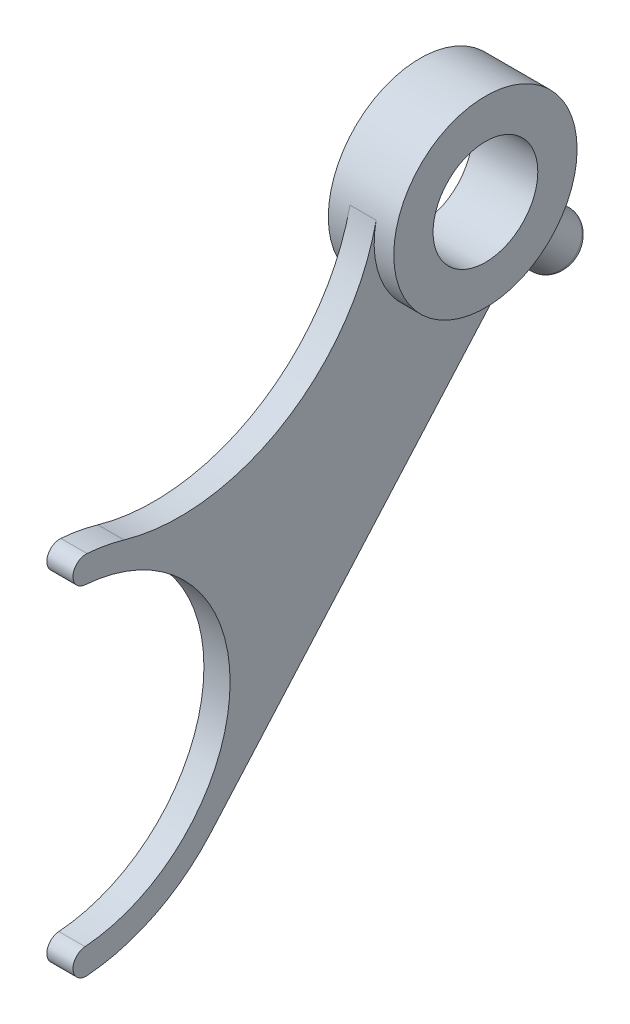
ISO-10303-21;
HEADER;
FILE_DESCRIPTION(('STEP AP214'),'2;1');
FILE_NAME('part.step','',(''),(''),'','','');
FILE_SCHEMA(('AUTOMOTIVE_DESIGN { 1 0 10303 214 1 1 1 1 }'));
ENDSEC;
DATA;
#1=APPLICATION_CONTEXT('core data for automotive mechanical design processes');
#2=APPLICATION_PROTOCOL_DEFINITION('international standard','automotive_design',2000,#1);
#3=PRODUCT_CONTEXT('',#1,'mechanical');
#4=PRODUCT('Part','Part','',(#3));
#5=PRODUCT_RELATED_PRODUCT_CATEGORY('part','',(#4));
#6=PRODUCT_DEFINITION_FORMATION('','',#4);
#7=PRODUCT_DEFINITION_CONTEXT('part definition',#1,'design');
#8=PRODUCT_DEFINITION('design','',#6,#7);
#9=PRODUCT_DEFINITION_SHAPE('','',#8);
#10=(LENGTH_UNIT() NAMED_UNIT(*) SI_UNIT(.MILLI.,.METRE.));
#11=(NAMED_UNIT(*) PLANE_ANGLE_UNIT() SI_UNIT($,.RADIAN.));
#12=(NAMED_UNIT(*) SI_UNIT($,.STERADIAN.) SOLID_ANGLE_UNIT());
#13=UNCERTAINTY_MEASURE_WITH_UNIT(LENGTH_MEASURE(1.E-05),#10,'distance_accuracy_value','');
#14=(GEOMETRIC_REPRESENTATION_CONTEXT(3) GLOBAL_UNCERTAINTY_ASSIGNED_CONTEXT((#13)) GLOBAL_UNIT_ASSIGNED_CONTEXT((#10,
#11,#12)) REPRESENTATION_CONTEXT('',''));
#15=CARTESIAN_POINT('',(0.,0.,0.));
#16=DIRECTION('',(0.,0.,1.));
#17=DIRECTION('',(1.,0.,0.));
#18=AXIS2_PLACEMENT_3D('',#15,#16,#17);
#19=CARTESIAN_POINT('',(1.2,-11.5355556337102,29.0769230769016));
#20=CARTESIAN_POINT('',(1.13333333333346,-11.5355556337102,29.0769230769016));
#21=CARTESIAN_POINT('',(1.0666666666665,-11.5355556337135,29.0769230768585));
#22=CARTESIAN_POINT('',(0.333333333335052,-11.5355556337134,29.0769230768611));
#23=CARTESIAN_POINT('',(-0.333333333333171,-11.5355556337135,29.0769230768587));
#24=CARTESIAN_POINT('',(-1.06666666666668,-11.5355556337135,29.0769230768587));
#25=CARTESIAN_POINT('',(-1.13333333333332,-11.5355556337102,29.0769230769016));
#26=CARTESIAN_POINT('',(-1.2,-11.5355556337102,29.0769230769016));
#27=CARTESIAN_POINT('',(1.2,-11.4842735824361,29.7416144305945));
#28=CARTESIAN_POINT('',(1.13333333333338,-11.4842735824361,29.7416144305945));
#29=CARTESIAN_POINT('',(1.06666666666663,-11.4842735824555,29.7416144305715));
#30=CARTESIAN_POINT('',(0.333333333335951,-11.484273582453,29.7416144305728));
#31=CARTESIAN_POINT('',(-0.333333333333171,-11.4842735824553,29.7416144305716));
#32=CARTESIAN_POINT('',(-1.06666666666668,-11.4842735824553,29.7416144305716));
#33=CARTESIAN_POINT('',(-1.13333333333332,-11.4842735824361,29.7416144305945));
#34=CARTESIAN_POINT('',(-1.2,-11.4842735824361,29.7416144305945));
#35=CARTESIAN_POINT('',(1.2,-10.9216525030672,30.5340170842672));
#36=CARTESIAN_POINT('',(1.13333333333327,-10.9216525030672,30.5340170842672));
#37=CARTESIAN_POINT('',(1.06666666666679,-10.9216525030781,30.534017084306));
#38=CARTESIAN_POINT('',(0.333333333337147,-10.9216525030762,30.5340170843022));
#39=CARTESIAN_POINT('',(-0.333333333333171,-10.921652503078,30.5340170843056));
#40=CARTESIAN_POINT('',(-1.06666666666668,-10.921652503078,30.5340170843056));
#41=CARTESIAN_POINT('',(-1.13333333333332,-10.9216525030672,30.5340170842672));
#42=CARTESIAN_POINT('',(-1.2,-10.9216525030672,30.5340170842672));
#43=CARTESIAN_POINT('',(1.2,-9.92461547251794,30.4570940073383));
#44=CARTESIAN_POINT('',(1.13333333333328,-9.92461547251794,30.4570940073383));
#45=CARTESIAN_POINT('',(1.06666666666678,-9.92461547247854,30.4570940073654));
#46=CARTESIAN_POINT('',(0.333333333337292,-9.92461547248108,30.4570940073616));
#47=CARTESIAN_POINT('',(-0.333333333333171,-9.92461547247877,30.4570940073651));
#48=CARTESIAN_POINT('',(-1.06666666666668,-9.92461547247877,30.4570940073651));
#49=CARTESIAN_POINT('',(-1.13333333333332,-9.92461547251794,30.4570940073383));
#50=CARTESIAN_POINT('',(-1.2,-9.92461547251794,30.4570940073383));
#51=CARTESIAN_POINT('',(1.2,-9.49019952136567,29.5877682767389));
#52=CARTESIAN_POINT('',(1.1333333333334,-9.49019952136567,29.5877682767389));
#53=CARTESIAN_POINT('',(1.0666666666666,-9.49019952134094,29.5877682766969));
#54=CARTESIAN_POINT('',(0.33333333333624,-9.49019952134284,29.5877682766982));
#55=CARTESIAN_POINT('',(-0.333333333333171,-9.49019952134111,29.587768276697));
#56=CARTESIAN_POINT('',(-1.06666666666668,-9.49019952134111,29.587768276697));
#57=CARTESIAN_POINT('',(-1.13333333333332,-9.49019952136567,29.5877682767389));
#58=CARTESIAN_POINT('',(-1.2,-9.49019952136567,29.5877682767389));
#59=CARTESIAN_POINT('',(1.2,-9.54148157266225,28.9230769230477));
#60=CARTESIAN_POINT('',(1.13333333333348,-9.54148157266225,28.9230769230477));
#61=CARTESIAN_POINT('',(1.06666666666647,-9.54148157266677,28.9230769229891));
#62=CARTESIAN_POINT('',(0.333333333335341,-9.54148157266658,28.9230769229917));
#63=CARTESIAN_POINT('',(-0.333333333333171,-9.54148157266676,28.9230769229894));
#64=CARTESIAN_POINT('',(-1.06666666666668,-9.54148157266676,28.9230769229894));
#65=CARTESIAN_POINT('',(-1.13333333333332,-9.54148157266225,28.9230769230477));
#66=CARTESIAN_POINT('',(-1.2,-9.54148157266225,28.9230769230477));
#67=(BOUNDED_SURFACE() B_SPLINE_SURFACE(5,3,((#19,#20,#21,#22,#23,#24,#25,#26),(#27,#28,#29,#30,
#31,#32,#33,#34),(#35,#36,#37,#38,#39,#40,#41,#42),(#43,#44,#45,#46,#47,#48,#49,#50),(#51,#52,
#53,#54,#55,#56,#57,#58),(#59,#60,#61,#62,#63,#64,#65,#66)),.UNSPECIFIED.,.F.,.F.,
.F.) B_SPLINE_SURFACE_WITH_KNOTS((6,6),(4,2,2,4),(0.,1.),(-0.1,0.,1.,1.1),
.UNSPECIFIED.) GEOMETRIC_REPRESENTATION_ITEM() RATIONAL_B_SPLINE_SURFACE(((1.,1.,1.,1.,1.,1.,1.,
1.),(0.599999999993241,0.599999999993241,0.599999999979541,0.599999999981577,0.599999999979726,
0.599999999979726,0.599999999993241,0.599999999993241),(0.399999999989862,0.399999999989862,
0.399999999969312,0.399999999972365,0.399999999969589,0.399999999969589,0.399999999989862,
0.399999999989862),(0.399999999989862,0.399999999989862,0.399999999969312,0.399999999972365,
0.399999999969589,0.399999999969589,0.399999999989862,0.399999999989862),(0.599999999993241,
0.599999999993241,0.599999999979541,0.599999999981577,0.599999999979726,0.599999999979726,
0.599999999993241,0.599999999993241),(1.,1.,1.,1.,1.,1.,1.,1.))) REPRESENTATION_ITEM('') SURFACE());
#68=CARTESIAN_POINT('',(1.2,-9.54148157266225,28.9230769230477));
#69=CARTESIAN_POINT('',(1.13333333333348,-9.54148157266225,28.9230769230477));
#70=CARTESIAN_POINT('',(1.06666666666647,-9.54148157266677,28.9230769229891));
#71=CARTESIAN_POINT('',(0.333333333335341,-9.54148157266658,28.9230769229917));
#72=CARTESIAN_POINT('',(-0.333333333333171,-9.54148157266676,28.9230769229894));
#73=CARTESIAN_POINT('',(-1.06666666666668,-9.54148157266676,28.9230769229894));
#74=CARTESIAN_POINT('',(-1.13333333333332,-9.54148157266225,28.9230769230477));
#75=CARTESIAN_POINT('',(-1.2,-9.54148157266225,28.9230769230477));
#76=(BOUNDED_CURVE() B_SPLINE_CURVE(3,(#68,#69,#70,#71,#72,#73,#74,#75),.UNSPECIFIED.,.F.,
.F.) B_SPLINE_CURVE_WITH_KNOTS((4,2,2,4),(-0.1,0.,1.,1.1),
.UNSPECIFIED.) CURVE() GEOMETRIC_REPRESENTATION_ITEM() RATIONAL_B_SPLINE_CURVE((1.,1.,1.,1.,1.,
1.,1.,1.)) REPRESENTATION_ITEM(''));
#77=CARTESIAN_POINT('',(-1.,-9.54148157266676,28.9230769229894));
#78=VERTEX_POINT('',#77);
#79=CARTESIAN_POINT('',(1.,-9.54148157266676,28.9230769229894));
#80=VERTEX_POINT('',#79);
#81=EDGE_CURVE('E210',#78,#80,#76,.F.);
#82=CARTESIAN_POINT('',(-1.,-9.54148157266676,28.9230769229894));
#83=CARTESIAN_POINT('',(-1.,-9.49019952134111,29.587768276697));
#84=CARTESIAN_POINT('',(-1.,-9.92461547247877,30.4570940073651));
#85=CARTESIAN_POINT('',(-1.,-10.921652503078,30.5340170843056));
#86=CARTESIAN_POINT('',(-1.,-11.4842735824553,29.7416144305716));
#87=CARTESIAN_POINT('',(-1.,-11.5355556337135,29.0769230768587));
#88=(BOUNDED_CURVE() B_SPLINE_CURVE(5,(#82,#83,#84,#85,#86,#87),.UNSPECIFIED.,.F.,
.F.) B_SPLINE_CURVE_WITH_KNOTS((6,6),(0.,1.),
.UNSPECIFIED.) CURVE() GEOMETRIC_REPRESENTATION_ITEM() RATIONAL_B_SPLINE_CURVE((1.,
0.599999999979726,0.399999999969589,0.399999999969589,0.599999999979726,1.)) REPRESENTATION_ITEM(''));
#89=CARTESIAN_POINT('',(-1.,-11.5355556337135,29.0769230768587));
#90=VERTEX_POINT('',#89);
#91=EDGE_CURVE('E61',#90,#78,#88,.F.);
#92=CARTESIAN_POINT('',(-1.2,-11.5355556337102,29.0769230769016));
#93=CARTESIAN_POINT('',(-1.13333333333332,-11.5355556337102,29.0769230769016));
#94=CARTESIAN_POINT('',(-1.06666666666668,-11.5355556337135,29.0769230768587));
#95=CARTESIAN_POINT('',(-0.333333333333171,-11.5355556337135,29.0769230768587));
#96=CARTESIAN_POINT('',(0.333333333335052,-11.5355556337134,29.0769230768611));
#97=CARTESIAN_POINT('',(1.0666666666665,-11.5355556337135,29.0769230768585));
#98=CARTESIAN_POINT('',(1.13333333333346,-11.5355556337102,29.0769230769016));
#99=CARTESIAN_POINT('',(1.2,-11.5355556337102,29.0769230769016));
#100=(BOUNDED_CURVE() B_SPLINE_CURVE(3,(#92,#93,#94,#95,#96,#97,#98,#99),.UNSPECIFIED.,.F.,
.F.) B_SPLINE_CURVE_WITH_KNOTS((4,2,2,4),(-0.1,0.,1.,1.1),
.UNSPECIFIED.) CURVE() GEOMETRIC_REPRESENTATION_ITEM() RATIONAL_B_SPLINE_CURVE((1.,1.,1.,1.,1.,
1.,1.,1.)) REPRESENTATION_ITEM(''));
#101=CARTESIAN_POINT('',(1.,-11.5355556337135,29.0769230768587));
#102=VERTEX_POINT('',#101);
#103=EDGE_CURVE('E213',#102,#90,#100,.F.);
#104=CARTESIAN_POINT('',(0.999999999999999,-11.5355556337135,29.0769230768587));
#105=CARTESIAN_POINT('',(0.999999999999999,-11.4842735824553,29.7416144305716));
#106=CARTESIAN_POINT('',(0.999999999999999,-10.921652503078,30.5340170843056));
#107=CARTESIAN_POINT('',(0.999999999999999,-9.92461547247877,30.4570940073651));
#108=CARTESIAN_POINT('',(1.,-9.49019952134111,29.587768276697));
#109=CARTESIAN_POINT('',(0.999999999999999,-9.54148157266676,28.9230769229894));
#110=(BOUNDED_CURVE() B_SPLINE_CURVE(5,(#104,#105,#106,#107,#108,#109),.UNSPECIFIED.,.F.,
.F.) B_SPLINE_CURVE_WITH_KNOTS((6,6),(0.,1.),
.UNSPECIFIED.) CURVE() GEOMETRIC_REPRESENTATION_ITEM() RATIONAL_B_SPLINE_CURVE((1.,
0.599999999979726,0.399999999969589,0.399999999969589,0.599999999979726,1.)) REPRESENTATION_ITEM(''));
#111=EDGE_CURVE('E11',#80,#102,#110,.F.);
#112=ORIENTED_EDGE('',*,*,#81,.F.);
#113=ORIENTED_EDGE('',*,*,#91,.F.);
#114=ORIENTED_EDGE('',*,*,#103,.F.);
#115=ORIENTED_EDGE('',*,*,#111,.F.);
#116=EDGE_LOOP('',(#112,#113,#114,#115));
#117=FACE_BOUND('',#116,.T.);
#118=ADVANCED_FACE('F50',(#117),#67,.T.);
#119=CARTESIAN_POINT('',(1.2,-37.45851842734,28.9230769230769));
#120=CARTESIAN_POINT('',(1.13333333333348,-37.45851842734,28.9230769230769));
#121=CARTESIAN_POINT('',(1.06666666666647,-37.45851842734,28.9230769230774));
#122=CARTESIAN_POINT('',(0.333333333335341,-37.4585184273397,28.9230769230723));
#123=CARTESIAN_POINT('',(-0.333333333333171,-37.45851842734,28.9230769230769));
#124=CARTESIAN_POINT('',(-1.06666666666668,-37.45851842734,28.9230769230769));
#125=CARTESIAN_POINT('',(-1.13333333333332,-37.45851842734,28.9230769230769));
#126=CARTESIAN_POINT('',(-1.2,-37.45851842734,28.9230769230769));
#127=CARTESIAN_POINT('',(1.2,-37.5098004786221,29.5877682767598));
#128=CARTESIAN_POINT('',(1.1333333333334,-37.5098004786221,29.5877682767598));
#129=CARTESIAN_POINT('',(1.06666666666658,-37.5098004786218,29.5877682767601));
#130=CARTESIAN_POINT('',(0.333333333334184,-37.5098004786244,29.5877682767563));
#131=CARTESIAN_POINT('',(-0.333333333333171,-37.5098004786221,29.5877682767598));
#132=CARTESIAN_POINT('',(-1.06666666666668,-37.5098004786221,29.5877682767598));
#133=CARTESIAN_POINT('',(-1.13333333333332,-37.5098004786221,29.5877682767598));
#134=CARTESIAN_POINT('',(-1.2,-37.5098004786221,29.5877682767598));
#135=CARTESIAN_POINT('',(1.2,-37.0753845274625,30.4570940073249));
#136=CARTESIAN_POINT('',(1.13333333333328,-37.0753845274625,30.4570940073249));
#137=CARTESIAN_POINT('',(1.06666666666673,-37.0753845274622,30.4570940073248));
#138=CARTESIAN_POINT('',(0.333333333332666,-37.0753845274648,30.457094007326));
#139=CARTESIAN_POINT('',(-0.333333333333171,-37.0753845274625,30.4570940073249));
#140=CARTESIAN_POINT('',(-1.06666666666668,-37.0753845274625,30.4570940073249));
#141=CARTESIAN_POINT('',(-1.13333333333332,-37.0753845274625,30.4570940073249));
#142=CARTESIAN_POINT('',(-1.2,-37.0753845274625,30.4570940073249));
#143=CARTESIAN_POINT('',(1.2,-36.0783474969382,30.534017084248));
#144=CARTESIAN_POINT('',(1.13333333333327,-36.0783474969382,30.534017084248));
#145=CARTESIAN_POINT('',(1.06666666666675,-36.0783474969384,30.534017084248));
#146=CARTESIAN_POINT('',(0.333333333332522,-36.0783474969359,30.534017084248));
#147=CARTESIAN_POINT('',(-0.333333333333171,-36.0783474969382,30.534017084248));
#148=CARTESIAN_POINT('',(-1.06666666666668,-36.0783474969382,30.534017084248));
#149=CARTESIAN_POINT('',(-1.13333333333332,-36.0783474969382,30.534017084248));
#150=CARTESIAN_POINT('',(-1.2,-36.0783474969382,30.534017084248));
#151=CARTESIAN_POINT('',(1.2,-35.5157264175735,29.7416144306059));
#152=CARTESIAN_POINT('',(1.13333333333338,-35.5157264175735,29.7416144306059));
#153=CARTESIAN_POINT('',(1.06666666666661,-35.5157264175737,29.741614430606));
#154=CARTESIAN_POINT('',(0.333333333333895,-35.5157264175712,29.7416144306048));
#155=CARTESIAN_POINT('',(-0.333333333333171,-35.5157264175735,29.7416144306059));
#156=CARTESIAN_POINT('',(-1.06666666666668,-35.5157264175735,29.7416144306059));
#157=CARTESIAN_POINT('',(-1.13333333333332,-35.5157264175735,29.7416144306059));
#158=CARTESIAN_POINT('',(-1.2,-35.5157264175735,29.7416144306059));
#159=CARTESIAN_POINT('',(1.2,-35.4644443662914,29.0769230769231));
#160=CARTESIAN_POINT('',(1.13333333333346,-35.4644443662914,29.0769230769231));
#161=CARTESIAN_POINT('',(1.0666666666665,-35.4644443662915,29.0769230769234));
#162=CARTESIAN_POINT('',(0.333333333335052,-35.4644443662912,29.0769230769196));
#163=CARTESIAN_POINT('',(-0.333333333333171,-35.4644443662914,29.0769230769231));
#164=CARTESIAN_POINT('',(-1.06666666666668,-35.4644443662914,29.0769230769231));
#165=CARTESIAN_POINT('',(-1.13333333333332,-35.4644443662914,29.0769230769231));
#166=CARTESIAN_POINT('',(-1.2,-35.4644443662914,29.0769230769231));
#167=(BOUNDED_SURFACE() B_SPLINE_SURFACE(5,3,((#119,#120,#121,#122,#123,#124,#125,#126),(#127,
#128,#129,#130,#131,#132,#133,#134),(#135,#136,#137,#138,#139,#140,#141,#142),(#143,#144,#145,
#146,#147,#148,#149,#150),(#151,#152,#153,#154,#155,#156,#157,#158),(#159,#160,#161,#162,#163,
#164,#165,#166)),.UNSPECIFIED.,.F.,.F.,.F.) B_SPLINE_SURFACE_WITH_KNOTS((6,6),(4,2,2,4),(0.,1.),
(-0.1,0.,1.,1.1),.UNSPECIFIED.) GEOMETRIC_REPRESENTATION_ITEM() RATIONAL_B_SPLINE_SURFACE(((1.,
1.,1.,1.,1.,1.,1.,1.),(0.600000000000001,0.600000000000001,0.600000000000001,0.600000000000001,
0.600000000000001,0.600000000000001,0.600000000000001,0.600000000000001),(0.400000000000002,
0.400000000000002,0.400000000000002,0.400000000000002,0.400000000000002,0.400000000000002,
0.400000000000002,0.400000000000002),(0.400000000000002,0.400000000000002,0.400000000000002,
0.400000000000002,0.400000000000002,0.400000000000002,0.400000000000002,0.400000000000002),
(0.600000000000001,0.600000000000001,0.600000000000001,0.600000000000001,0.600000000000001,
0.600000000000001,0.600000000000001,0.600000000000001),(1.,1.,1.,1.,1.,1.,1.,1.))) REPRESENTATION_ITEM('') SURFACE());
#168=CARTESIAN_POINT('',(-1.2,-37.45851842734,28.9230769230769));
#169=CARTESIAN_POINT('',(-1.13333333333332,-37.45851842734,28.9230769230769));
#170=CARTESIAN_POINT('',(-1.06666666666668,-37.45851842734,28.9230769230769));
#171=CARTESIAN_POINT('',(-0.333333333333171,-37.45851842734,28.9230769230769));
#172=CARTESIAN_POINT('',(0.333333333335341,-37.4585184273397,28.9230769230723));
#173=CARTESIAN_POINT('',(1.06666666666647,-37.45851842734,28.9230769230774));
#174=CARTESIAN_POINT('',(1.13333333333348,-37.45851842734,28.9230769230769));
#175=CARTESIAN_POINT('',(1.2,-37.45851842734,28.9230769230769));
#176=(BOUNDED_CURVE() B_SPLINE_CURVE(3,(#168,#169,#170,#171,#172,#173,#174,#175),.UNSPECIFIED.,
.F.,.F.) B_SPLINE_CURVE_WITH_KNOTS((4,2,2,4),(-0.1,0.,1.,1.1),
.UNSPECIFIED.) CURVE() GEOMETRIC_REPRESENTATION_ITEM() RATIONAL_B_SPLINE_CURVE((1.,1.,1.,1.,1.,
1.,1.,1.)) REPRESENTATION_ITEM(''));
#177=CARTESIAN_POINT('',(1.,-37.45851842734,28.9230769230769));
#178=VERTEX_POINT('',#177);
#179=CARTESIAN_POINT('',(-1.,-37.45851842734,28.9230769230769));
#180=VERTEX_POINT('',#179);
#181=EDGE_CURVE('E379',#178,#180,#176,.F.);
#182=CARTESIAN_POINT('',(1.,-37.45851842734,28.9230769230769));
#183=CARTESIAN_POINT('',(1.,-37.5098004786221,29.5877682767598));
#184=CARTESIAN_POINT('',(1.,-37.0753845274625,30.4570940073249));
#185=CARTESIAN_POINT('',(1.,-36.0783474969382,30.534017084248));
#186=CARTESIAN_POINT('',(1.,-35.5157264175735,29.7416144306059));
#187=CARTESIAN_POINT('',(1.,-35.4644443662914,29.0769230769231));
#188=(BOUNDED_CURVE() B_SPLINE_CURVE(5,(#182,#183,#184,#185,#186,#187),.UNSPECIFIED.,.F.,
.F.) B_SPLINE_CURVE_WITH_KNOTS((6,6),(0.,1.),
.UNSPECIFIED.) CURVE() GEOMETRIC_REPRESENTATION_ITEM() RATIONAL_B_SPLINE_CURVE((1.,
0.600000000000001,0.400000000000002,0.400000000000002,0.600000000000001,1.)) REPRESENTATION_ITEM(''));
#189=CARTESIAN_POINT('',(1.,-35.4644443662914,29.0769230769231));
#190=VERTEX_POINT('',#189);
#191=EDGE_CURVE('E418',#190,#178,#188,.F.);
#192=CARTESIAN_POINT('',(1.2,-35.4644443662914,29.0769230769231));
#193=CARTESIAN_POINT('',(1.13333333333346,-35.4644443662914,29.0769230769231));
#194=CARTESIAN_POINT('',(1.0666666666665,-35.4644443662915,29.0769230769234));
#195=CARTESIAN_POINT('',(0.333333333335052,-35.4644443662912,29.0769230769196));
#196=CARTESIAN_POINT('',(-0.333333333333171,-35.4644443662914,29.0769230769231));
#197=CARTESIAN_POINT('',(-1.06666666666668,-35.4644443662914,29.0769230769231));
#198=CARTESIAN_POINT('',(-1.13333333333332,-35.4644443662914,29.0769230769231));
#199=CARTESIAN_POINT('',(-1.2,-35.4644443662914,29.0769230769231));
#200=(BOUNDED_CURVE() B_SPLINE_CURVE(3,(#192,#193,#194,#195,#196,#197,#198,#199),.UNSPECIFIED.,
.F.,.F.) B_SPLINE_CURVE_WITH_KNOTS((4,2,2,4),(-0.1,0.,1.,1.1),
.UNSPECIFIED.) CURVE() GEOMETRIC_REPRESENTATION_ITEM() RATIONAL_B_SPLINE_CURVE((1.,1.,1.,1.,1.,
1.,1.,1.)) REPRESENTATION_ITEM(''));
#201=CARTESIAN_POINT('',(-1.,-35.4644443662914,29.0769230769231));
#202=VERTEX_POINT('',#201);
#203=EDGE_CURVE('E323',#202,#190,#200,.F.);
#204=CARTESIAN_POINT('',(-1.,-35.4644443662914,29.0769230769231));
#205=CARTESIAN_POINT('',(-1.,-35.5157264175735,29.7416144306059));
#206=CARTESIAN_POINT('',(-1.,-36.0783474969382,30.534017084248));
#207=CARTESIAN_POINT('',(-1.,-37.0753845274625,30.4570940073249));
#208=CARTESIAN_POINT('',(-1.,-37.5098004786221,29.5877682767598));
#209=CARTESIAN_POINT('',(-1.,-37.45851842734,28.9230769230769));
#210=(BOUNDED_CURVE() B_SPLINE_CURVE(5,(#204,#205,#206,#207,#208,#209),.UNSPECIFIED.,.F.,
.F.) B_SPLINE_CURVE_WITH_KNOTS((6,6),(0.,1.),
.UNSPECIFIED.) CURVE() GEOMETRIC_REPRESENTATION_ITEM() RATIONAL_B_SPLINE_CURVE((1.,
0.600000000000001,0.400000000000002,0.400000000000002,0.600000000000001,1.)) REPRESENTATION_ITEM(''));
#211=EDGE_CURVE('E212',#180,#202,#210,.F.);
#212=ORIENTED_EDGE('',*,*,#181,.F.);
#213=ORIENTED_EDGE('',*,*,#191,.F.);
#214=ORIENTED_EDGE('',*,*,#203,.F.);
#215=ORIENTED_EDGE('',*,*,#211,.F.);
#216=EDGE_LOOP('',(#212,#213,#214,#215));
#217=FACE_BOUND('',#216,.T.);
#218=ADVANCED_FACE('F199',(#217),#167,.T.);
#219=CARTESIAN_POINT('',(1.,0.,0.));
#220=DIRECTION('',(1.,0.,0.));
#221=DIRECTION('',(0.,0.,-1.));
#222=AXIS2_PLACEMENT_3D('',#219,#220,#221);
#223=PLANE('',#222);
#224=CARTESIAN_POINT('',(1.,-23.5,30.));
#225=DIRECTION('',(1.,0.,0.));
#226=DIRECTION('',(0.,0.,-1.));
#227=AXIS2_PLACEMENT_3D('',#224,#225,#226);
#228=CIRCLE('',#227,14.);
#229=CARTESIAN_POINT('',(1.,-10.0532803966568,26.1031125357454));
#230=VERTEX_POINT('',#229);
#231=EDGE_CURVE('E241',#230,#80,#228,.T.);
#232=ORIENTED_EDGE('',*,*,#231,.T.);
#233=ORIENTED_EDGE('',*,*,#111,.T.);
#234=CARTESIAN_POINT('',(1.,-23.5,30.));
#235=DIRECTION('',(1.,0.,0.));
#236=DIRECTION('',(0.,0.,-1.));
#237=AXIS2_PLACEMENT_3D('',#234,#235,#236);
#238=CIRCLE('',#237,12.);
#239=EDGE_CURVE('E221',#190,#102,#238,.T.);
#240=ORIENTED_EDGE('',*,*,#239,.F.);
#241=ORIENTED_EDGE('',*,*,#191,.T.);
#242=CARTESIAN_POINT('',(1.,-32.747850597645,19.4891836985114));
#243=VERTEX_POINT('',#242);
#244=EDGE_CURVE('E232',#178,#243,#228,.T.);
#245=ORIENTED_EDGE('',*,*,#244,.T.);
#246=DIRECTION('',(0.,0.750772592963468,-0.660560756974641));
#247=VECTOR('',#246,1.);
#248=CARTESIAN_POINT('',(1.,-4.62392529882248,-5.25540815074428));
#249=LINE('',#248,#247);
#250=CARTESIAN_POINT('',(1.,-6.26287883441165,-3.81338909162857));
#251=VERTEX_POINT('',#250);
#252=EDGE_CURVE('E135',#243,#251,#249,.T.);
#253=ORIENTED_EDGE('',*,*,#252,.T.);
#254=DIRECTION('',(0.,0.707106781186541,0.707106781186554));
#255=VECTOR('',#254,1.);
#256=CARTESIAN_POINT('',(1.,-1.2247448713916,1.22474487139158));
#257=LINE('',#256,#255);
#258=CARTESIAN_POINT('',(1.,-6.02057639470428,-3.57108665192118));
#259=VERTEX_POINT('',#258);
#260=EDGE_CURVE('E137',#251,#259,#257,.T.);
#261=ORIENTED_EDGE('',*,*,#260,.T.);
#262=CARTESIAN_POINT('',(1.,0.,0.));
#263=DIRECTION('',(1.,0.,0.));
#264=DIRECTION('',(0.,0.,-1.));
#265=AXIS2_PLACEMENT_3D('',#262,#263,#264);
#266=CIRCLE('',#265,7.);
#267=CARTESIAN_POINT('',(1.,1.46422494326146,6.84514757441583));
#268=VERTEX_POINT('',#267);
#269=EDGE_CURVE('E124',#268,#259,#266,.T.);
#270=ORIENTED_EDGE('',*,*,#269,.F.);
#271=CARTESIAN_POINT('',(1.,4.67087756900406,21.8360207623865));
#272=DIRECTION('',(1.,0.,0.));
#273=DIRECTION('',(0.,0.,-1.));
#274=AXIS2_PLACEMENT_3D('',#271,#272,#273);
#275=CIRCLE('',#274,15.33);
#276=EDGE_CURVE('E133',#230,#268,#275,.T.);
#277=ORIENTED_EDGE('',*,*,#276,.F.);
#278=EDGE_LOOP('',(#232,#233,#240,#241,#245,#253,#261,#270,#277));
#279=FACE_BOUND('',#278,.T.);
#280=ADVANCED_FACE('F139',(#279),#223,.T.);
#281=CARTESIAN_POINT('',(-1.,0.,0.));
#282=DIRECTION('',(1.,0.,0.));
#283=DIRECTION('',(0.,0.,-1.));
#284=AXIS2_PLACEMENT_3D('',#281,#282,#283);
#285=PLANE('',#284);
#286=CARTESIAN_POINT('',(-1.,-23.5,30.));
#287=DIRECTION('',(1.,0.,0.));
#288=DIRECTION('',(0.,0.,-1.));
#289=AXIS2_PLACEMENT_3D('',#286,#287,#288);
#290=CIRCLE('',#289,12.);
#291=EDGE_CURVE('E254',#202,#90,#290,.T.);
#292=ORIENTED_EDGE('',*,*,#291,.T.);
#293=ORIENTED_EDGE('',*,*,#91,.T.);
#294=CARTESIAN_POINT('',(-1.,-23.5,30.));
#295=DIRECTION('',(1.,0.,0.));
#296=DIRECTION('',(0.,0.,-1.));
#297=AXIS2_PLACEMENT_3D('',#294,#295,#296);
#298=CIRCLE('',#297,14.);
#299=CARTESIAN_POINT('',(-1.,-10.0532803966568,26.1031125357454));
#300=VERTEX_POINT('',#299);
#301=EDGE_CURVE('E217',#300,#78,#298,.T.);
#302=ORIENTED_EDGE('',*,*,#301,.F.);
#303=CARTESIAN_POINT('',(-1.,4.67087756900406,21.8360207623865));
#304=DIRECTION('',(1.,0.,0.));
#305=DIRECTION('',(0.,0.,-1.));
#306=AXIS2_PLACEMENT_3D('',#303,#304,#305);
#307=CIRCLE('',#306,15.33);
#308=CARTESIAN_POINT('',(-1.,1.46422494326146,6.84514757441583));
#309=VERTEX_POINT('',#308);
#310=EDGE_CURVE('E223',#300,#309,#307,.T.);
#311=ORIENTED_EDGE('',*,*,#310,.T.);
#312=CARTESIAN_POINT('',(-1.,0.,0.));
#313=DIRECTION('',(1.,0.,0.));
#314=DIRECTION('',(0.,0.,-1.));
#315=AXIS2_PLACEMENT_3D('',#312,#313,#314);
#316=CIRCLE('',#315,7.);
#317=CARTESIAN_POINT('',(-1.,-6.02057639470428,-3.57108665192118));
#318=VERTEX_POINT('',#317);
#319=EDGE_CURVE('E234',#309,#318,#316,.T.);
#320=ORIENTED_EDGE('',*,*,#319,.T.);
#321=DIRECTION('',(0.,0.707106781186541,0.707106781186554));
#322=VECTOR('',#321,1.);
#323=CARTESIAN_POINT('',(-1.,-1.2247448713916,1.22474487139158));
#324=LINE('',#323,#322);
#325=CARTESIAN_POINT('',(-1.,-6.26287883441165,-3.81338909162857));
#326=VERTEX_POINT('',#325);
#327=EDGE_CURVE('E148',#326,#318,#324,.T.);
#328=ORIENTED_EDGE('',*,*,#327,.F.);
#329=DIRECTION('',(0.,0.750772592963468,-0.660560756974641));
#330=VECTOR('',#329,1.);
#331=CARTESIAN_POINT('',(-1.,-4.62392529882248,-5.25540815074428));
#332=LINE('',#331,#330);
#333=CARTESIAN_POINT('',(-1.,-32.747850597645,19.4891836985114));
#334=VERTEX_POINT('',#333);
#335=EDGE_CURVE('E248',#334,#326,#332,.T.);
#336=ORIENTED_EDGE('',*,*,#335,.F.);
#337=EDGE_CURVE('E252',#180,#334,#298,.T.);
#338=ORIENTED_EDGE('',*,*,#337,.F.);
#339=ORIENTED_EDGE('',*,*,#211,.T.);
#340=EDGE_LOOP('',(#292,#293,#302,#311,#320,#328,#336,#338,#339));
#341=FACE_BOUND('',#340,.T.);
#342=ADVANCED_FACE('F360',(#341),#285,.F.);
#343=CARTESIAN_POINT('',(2.5,0.,0.));
#344=DIRECTION('',(-1.,0.,0.));
#345=DIRECTION('',(0.,0.,1.));
#346=AXIS2_PLACEMENT_3D('',#343,#344,#345);
#347=CYLINDRICAL_SURFACE('',#346,7.);
#348=CARTESIAN_POINT('',(-2.5,0.,0.));
#349=DIRECTION('',(1.,0.,0.));
#350=DIRECTION('',(0.,0.,-1.));
#351=AXIS2_PLACEMENT_3D('',#348,#349,#350);
#352=CIRCLE('',#351,7.);
#353=CARTESIAN_POINT('',(-2.5,0.,-7.));
#354=VERTEX_POINT('',#353);
#355=EDGE_CURVE('E290',#354,#354,#352,.T.);
#356=ORIENTED_EDGE('',*,*,#355,.T.);
#357=EDGE_LOOP('',(#356));
#358=FACE_BOUND('',#357,.T.);
#359=CARTESIAN_POINT('',(2.5,0.,0.));
#360=DIRECTION('',(1.,0.,0.));
#361=DIRECTION('',(0.,0.,-1.));
#362=AXIS2_PLACEMENT_3D('',#359,#360,#361);
#363=CIRCLE('',#362,7.);
#364=CARTESIAN_POINT('',(2.5,0.,-7.));
#365=VERTEX_POINT('',#364);
#366=EDGE_CURVE('E296',#365,#365,#363,.T.);
#367=ORIENTED_EDGE('',*,*,#366,.F.);
#368=EDGE_LOOP('',(#367));
#369=FACE_BOUND('',#368,.T.);
#370=CARTESIAN_POINT('',(0.,-6.15763005262563,-3.32920292787953));
#371=CARTESIAN_POINT('',(-0.109851537877241,-6.15762974012802,-3.32920541486868));
#372=CARTESIAN_POINT('',(-0.21972308425451,-6.15313747110836,-3.33755329207586));
#373=CARTESIAN_POINT('',(-0.436271238862975,-6.13516074008908,-3.37048122362133));
#374=CARTESIAN_POINT('',(-0.542946529100624,-6.12167262050639,-3.3950678803736));
#375=CARTESIAN_POINT('',(-0.749937200871498,-6.08571488573628,-3.45910532358216));
#376=CARTESIAN_POINT('',(-0.850262151817136,-6.06325917614855,-3.49853309124873));
#377=CARTESIAN_POINT('',(-1.04216781155437,-6.00934192522525,-3.59035276242996));
#378=CARTESIAN_POINT('',(-1.13374748037803,-5.97787931458477,-3.64274620513748));
#379=CARTESIAN_POINT('',(-1.30819156531483,-5.90500816518146,-3.75975253853271));
#380=CARTESIAN_POINT('',(-1.39076780212922,-5.86336250153027,-3.82464748777605));
#381=CARTESIAN_POINT('',(-1.54230278330379,-5.77069200700847,-3.96308489663061));
#382=CARTESIAN_POINT('',(-1.61125993312284,-5.71966607923261,-4.03662836721609));
#383=CARTESIAN_POINT('',(-1.73482864835351,-5.60755430662495,-4.19101290325058));
#384=CARTESIAN_POINT('',(-1.78914961975098,-5.54629904383648,-4.27196423651113));
#385=CARTESIAN_POINT('',(-1.88000177441597,-5.41525981920578,-4.43689489095732));
#386=CARTESIAN_POINT('',(-1.91653642124026,-5.34547752115914,-4.52087361919022));
#387=CARTESIAN_POINT('',(-1.96983446123971,-5.20073768475366,-4.68658821710034));
#388=CARTESIAN_POINT('',(-1.98708902170467,-5.12596276907259,-4.76832541519992));
#389=CARTESIAN_POINT('',(-2.00288673388323,-4.97162610095512,-4.92902984361005));
#390=CARTESIAN_POINT('',(-2.00143346233736,-4.8920652664311,-5.00799760051373));
#391=CARTESIAN_POINT('',(-1.98019362508197,-4.73293429647647,-5.15858457129101));
#392=CARTESIAN_POINT('',(-1.96093838736201,-4.65343095042057,-5.2303502460105));
#393=CARTESIAN_POINT('',(-1.90550489753563,-4.49471480846026,-5.36735842975639));
#394=CARTESIAN_POINT('',(-1.86932561573788,-4.41550203053014,-5.4326005415835));
#395=CARTESIAN_POINT('',(-1.78069059918818,-4.25912793106354,-5.55606618442055));
#396=CARTESIAN_POINT('',(-1.72806122219167,-4.18199851042739,-5.614205173969));
#397=CARTESIAN_POINT('',(-1.60815541360198,-4.03335153749928,-5.72193277495674));
#398=CARTESIAN_POINT('',(-1.54087577233352,-3.96183521964081,-5.77151950843916));
#399=CARTESIAN_POINT('',(-1.39079428938141,-3.82461625708937,-5.86339270062552));
#400=CARTESIAN_POINT('',(-1.30753056639495,-3.75920572221635,-5.9053618869733));
#401=CARTESIAN_POINT('',(-1.12928490815404,-3.63985812261788,-5.97966458434284));
#402=CARTESIAN_POINT('',(-1.034302023051,-3.58592198886938,-6.01199731359475));
#403=CARTESIAN_POINT('',(-0.834269115502013,-3.49163557730528,-6.06724849505788));
#404=CARTESIAN_POINT('',(-0.729144774948343,-3.45139720150056,-6.0900897264921));
#405=CARTESIAN_POINT('',(-0.512446836495383,-3.3872507352243,-6.12600189203162));
#406=CARTESIAN_POINT('',(-0.400875125340087,-3.36333789327174,-6.13907566901985));
#407=CARTESIAN_POINT('',(-0.178519575667688,-3.33373763722909,-6.15519858921021));
#408=CARTESIAN_POINT('',(-0.0678381830669846,-3.32745757557062,-6.1585738013468));
#409=CARTESIAN_POINT('',(0.153088315920963,-3.33178223864932,-6.15623537689439));
#410=CARTESIAN_POINT('',(0.263333475010922,-3.34238485716923,-6.15052287405332));
#411=CARTESIAN_POINT('',(0.477641228022954,-3.37943052834125,-6.13024252168032));
#412=CARTESIAN_POINT('',(0.581787586015159,-3.4055053182572,-6.11588043108736));
#413=CARTESIAN_POINT('',(0.783801871997734,-3.47185117670906,-6.07846119333411));
#414=CARTESIAN_POINT('',(0.881668891645646,-3.51212429366682,-6.0554027915056));
#415=CARTESIAN_POINT('',(1.07102207521674,-3.6061613072921,-5.99988697398141));
#416=CARTESIAN_POINT('',(1.16229044420219,-3.66023434808088,-5.96721111692764));
#417=CARTESIAN_POINT('',(1.33347637344336,-3.77901384263482,-5.89270399045165));
#418=CARTESIAN_POINT('',(1.41339146701213,-3.8437226006185,-5.8508707364345));
#419=CARTESIAN_POINT('',(1.56237941828818,-3.98358452661267,-5.75659539756182));
#420=CARTESIAN_POINT('',(1.63099497141873,-4.05901661739715,-5.70384274717764));
#421=CARTESIAN_POINT('',(1.75204568138273,-4.21562529311223,-5.58908872593058));
#422=CARTESIAN_POINT('',(1.80448168392238,-4.29680157752069,-5.52708783872505));
#423=CARTESIAN_POINT('',(1.89118428702633,-4.4612298618611,-5.39522355351825));
#424=CARTESIAN_POINT('',(1.92558838958615,-4.54446093034798,-5.32542473184491));
#425=CARTESIAN_POINT('',(1.97562680194018,-4.71059529121625,-5.17904737987271));
#426=CARTESIAN_POINT('',(1.99126594018131,-4.79349866244336,-5.10247059907065));
#427=CARTESIAN_POINT('',(2.00299143399779,-4.95330533829498,-4.94739641750658));
#428=CARTESIAN_POINT('',(1.99974414908282,-5.03031710076548,-4.86906050687657));
#429=CARTESIAN_POINT('',(1.97536171858971,-5.17922897822624,-4.7103532988478));
#430=CARTESIAN_POINT('',(1.95422742961796,-5.2511293378222,-4.62998209909759));
#431=CARTESIAN_POINT('',(1.89506863902115,-5.38751172691033,-4.47052980806707));
#432=CARTESIAN_POINT('',(1.85719682105602,-5.45205432832824,-4.39144360673889));
#433=CARTESIAN_POINT('',(1.76577384171452,-5.57335776851823,-4.23643493322159));
#434=CARTESIAN_POINT('',(1.71222025290775,-5.63011740054145,-4.16051295291211));
#435=CARTESIAN_POINT('',(1.58910266257518,-5.73677358682788,-4.01223425444077));
#436=CARTESIAN_POINT('',(1.51910991321159,-5.78641585938237,-3.94005069538803));
#437=CARTESIAN_POINT('',(1.36589087454606,-5.87645465529141,-3.80446035216819));
#438=CARTESIAN_POINT('',(1.28266092891517,-5.91684861656939,-3.74105600203943));
#439=CARTESIAN_POINT('',(1.10270308300454,-5.98922896872584,-3.62408624235452));
#440=CARTESIAN_POINT('',(1.00567805249652,-6.02096664285446,-3.57082302475952));
#441=CARTESIAN_POINT('',(0.802478134685367,-6.07458740184684,-3.47882748972135));
#442=CARTESIAN_POINT('',(0.696308408911665,-6.09647600294498,-3.44008704045107));
#443=CARTESIAN_POINT('',(0.492346299767347,-6.12819037115425,-3.38322257878267));
#444=CARTESIAN_POINT('',(0.395309651897477,-6.13923074927107,-3.36304608799106));
#445=CARTESIAN_POINT('',(0.198853881648081,-6.15395015056867,-3.33603618983235));
#446=CARTESIAN_POINT('',(0.0994351377689006,-6.15763033549143,-3.32920067671297));
#447=CARTESIAN_POINT('',(0.,-6.15763005262563,-3.32920292787953));
#448=B_SPLINE_CURVE_WITH_KNOTS('',3,(#370,#371,#372,#373,#374,#375,#376,#377,#378,#379,#380,
#381,#382,#383,#384,#385,#386,#387,#388,#389,#390,#391,#392,#393,#394,#395,#396,#397,#398,#399,
#400,#401,#402,#403,#404,#405,#406,#407,#408,#409,#410,#411,#412,#413,#414,#415,#416,#417,#418,
#419,#420,#421,#422,#423,#424,#425,#426,#427,#428,#429,#430,#431,#432,#433,#434,#435,#436,#437,
#438,#439,#440,#441,#442,#443,#444,#445,#446,#447),.UNSPECIFIED.,.T.,.F.,(4,2,2,2,2,2,2,2,2,2,2,
2,2,2,2,2,2,2,2,2,2,2,2,2,2,2,2,2,2,2,2,2,2,2,2,2,2,2,4),(0.,0.32918834236395,0.658510609618861,
0.987324183736436,1.31617681100734,1.65357167206616,1.99100601238483,2.33471483013846,
2.67835669017705,3.01302901028741,3.34763734552418,3.67257037643421,3.99752317946521,
4.32602903378491,4.65460693184835,4.99471612693,5.33485290629759,5.67770520630006,
6.02045767793011,6.3515436333348,6.68258828698449,7.00605289656511,7.3295641921604,
7.66108006042381,7.99266784620104,8.33545388376656,8.67822200084647,9.01833685298089,
9.35836417076638,9.6864689768406,10.0145580709057,10.3397141238921,10.6649205354322,
10.9997976874537,11.3347674991531,11.6785361242131,12.0221119721565,12.3201328886649,
12.61810676147),.UNSPECIFIED.);
#449=EDGE_CURVE('E130',#318,#259,#448,.T.);
#450=ORIENTED_EDGE('',*,*,#449,.F.);
#451=ORIENTED_EDGE('',*,*,#319,.F.);
#452=DIRECTION('',(-1.,0.,0.));
#453=VECTOR('',#452,1.);
#454=CARTESIAN_POINT('',(1.,1.46422494326146,6.84514757441583));
#455=LINE('',#454,#453);
#456=EDGE_CURVE('E128',#268,#309,#455,.T.);
#457=ORIENTED_EDGE('',*,*,#456,.F.);
#458=ORIENTED_EDGE('',*,*,#269,.T.);
#459=EDGE_LOOP('',(#450,#451,#457,#458));
#460=FACE_BOUND('',#459,.T.);
#461=ADVANCED_FACE('F123',(#358,#369,#460),#347,.T.);
#462=CARTESIAN_POINT('',(1.,-23.5,30.));
#463=DIRECTION('',(-1.,0.,0.));
#464=DIRECTION('',(0.,0.,1.));
#465=AXIS2_PLACEMENT_3D('',#462,#463,#464);
#466=CYLINDRICAL_SURFACE('',#465,12.);
#467=ORIENTED_EDGE('',*,*,#239,.T.);
#468=ORIENTED_EDGE('',*,*,#103,.T.);
#469=ORIENTED_EDGE('',*,*,#291,.F.);
#470=ORIENTED_EDGE('',*,*,#203,.T.);
#471=EDGE_LOOP('',(#467,#468,#469,#470));
#472=FACE_BOUND('',#471,.T.);
#473=ADVANCED_FACE('F328',(#472),#466,.F.);
#474=CARTESIAN_POINT('',(1.,-23.5,30.));
#475=DIRECTION('',(-1.,0.,0.));
#476=DIRECTION('',(0.,0.,1.));
#477=AXIS2_PLACEMENT_3D('',#474,#475,#476);
#478=CYLINDRICAL_SURFACE('',#477,14.);
#479=ORIENTED_EDGE('',*,*,#244,.F.);
#480=ORIENTED_EDGE('',*,*,#181,.T.);
#481=ORIENTED_EDGE('',*,*,#337,.T.);
#482=DIRECTION('',(-1.,0.,0.));
#483=VECTOR('',#482,1.);
#484=CARTESIAN_POINT('',(1.,-32.747850597645,19.4891836985114));
#485=LINE('',#484,#483);
#486=EDGE_CURVE('E155',#243,#334,#485,.T.);
#487=ORIENTED_EDGE('',*,*,#486,.F.);
#488=EDGE_LOOP('',(#479,#480,#481,#487));
#489=FACE_BOUND('',#488,.T.);
#490=ADVANCED_FACE('F198',(#489),#478,.T.);
#491=CARTESIAN_POINT('',(1.,-4.62392529882248,-5.25540815074428));
#492=DIRECTION('',(0.,0.660560756974641,0.750772592963468));
#493=DIRECTION('',(0.,-0.750772592963468,0.660560756974641));
#494=AXIS2_PLACEMENT_3D('',#491,#492,#493);
#495=PLANE('',#494);
#496=CARTESIAN_POINT('',(0.,-4.95984878434773,-4.95984878434781));
#497=DIRECTION('',(0.,0.660560756974641,0.750772592963468));
#498=DIRECTION('',(0.,0.750772592963468,-0.660560756974641));
#499=AXIS2_PLACEMENT_3D('',#496,#497,#498);
#500=ELLIPSE('',#499,2.00408154804123,2.);
#501=EDGE_CURVE('E144',#251,#326,#500,.F.);
#502=ORIENTED_EDGE('',*,*,#501,.F.);
#503=ORIENTED_EDGE('',*,*,#252,.F.);
#504=ORIENTED_EDGE('',*,*,#486,.T.);
#505=ORIENTED_EDGE('',*,*,#335,.T.);
#506=EDGE_LOOP('',(#502,#503,#504,#505));
#507=FACE_BOUND('',#506,.T.);
#508=ADVANCED_FACE('F284',(#507),#495,.F.);
#509=CARTESIAN_POINT('',(1.,4.67087756900406,21.8360207623865));
#510=DIRECTION('',(-1.,0.,0.));
#511=DIRECTION('',(0.,0.,1.));
#512=AXIS2_PLACEMENT_3D('',#509,#510,#511);
#513=CYLINDRICAL_SURFACE('',#512,15.33);
#514=ORIENTED_EDGE('',*,*,#310,.F.);
#515=DIRECTION('',(-1.,0.,0.));
#516=VECTOR('',#515,1.);
#517=CARTESIAN_POINT('',(1.,-10.0532803966568,26.1031125357454));
#518=LINE('',#517,#516);
#519=EDGE_CURVE('E218',#230,#300,#518,.T.);
#520=ORIENTED_EDGE('',*,*,#519,.F.);
#521=ORIENTED_EDGE('',*,*,#276,.T.);
#522=ORIENTED_EDGE('',*,*,#456,.T.);
#523=EDGE_LOOP('',(#514,#520,#521,#522));
#524=FACE_BOUND('',#523,.T.);
#525=ADVANCED_FACE('F193',(#524),#513,.F.);
#526=ORIENTED_EDGE('',*,*,#301,.T.);
#527=ORIENTED_EDGE('',*,*,#81,.T.);
#528=ORIENTED_EDGE('',*,*,#231,.F.);
#529=ORIENTED_EDGE('',*,*,#519,.T.);
#530=EDGE_LOOP('',(#526,#527,#528,#529));
#531=FACE_BOUND('',#530,.T.);
#532=ADVANCED_FACE('F187',(#531),#478,.T.);
#533=CARTESIAN_POINT('',(2.5,0.,0.));
#534=DIRECTION('',(-1.,0.,0.));
#535=DIRECTION('',(0.,0.,1.));
#536=AXIS2_PLACEMENT_3D('',#533,#534,#535);
#537=CYLINDRICAL_SURFACE('',#536,4.);
#538=CARTESIAN_POINT('',(2.5,0.,0.));
#539=DIRECTION('',(1.,0.,0.));
#540=DIRECTION('',(0.,0.,-1.));
#541=AXIS2_PLACEMENT_3D('',#538,#539,#540);
#542=CIRCLE('',#541,4.);
#543=CARTESIAN_POINT('',(2.5,0.,-4.));
#544=VERTEX_POINT('',#543);
#545=EDGE_CURVE('E300',#544,#544,#542,.T.);
#546=ORIENTED_EDGE('',*,*,#545,.T.);
#547=EDGE_LOOP('',(#546));
#548=FACE_BOUND('',#547,.T.);
#549=CARTESIAN_POINT('',(-2.5,0.,0.));
#550=DIRECTION('',(1.,0.,0.));
#551=DIRECTION('',(0.,0.,-1.));
#552=AXIS2_PLACEMENT_3D('',#549,#550,#551);
#553=CIRCLE('',#552,4.);
#554=CARTESIAN_POINT('',(-2.5,0.,-4.));
#555=VERTEX_POINT('',#554);
#556=EDGE_CURVE('E295',#555,#555,#553,.T.);
#557=ORIENTED_EDGE('',*,*,#556,.F.);
#558=EDGE_LOOP('',(#557));
#559=FACE_BOUND('',#558,.T.);
#560=ADVANCED_FACE('F185',(#548,#559),#537,.F.);
#561=CARTESIAN_POINT('',(2.5,0.,0.));
#562=DIRECTION('',(1.,0.,0.));
#563=DIRECTION('',(0.,0.,-1.));
#564=AXIS2_PLACEMENT_3D('',#561,#562,#563);
#565=PLANE('',#564);
#566=ORIENTED_EDGE('',*,*,#366,.T.);
#567=EDGE_LOOP('',(#566));
#568=FACE_BOUND('',#567,.T.);
#569=ORIENTED_EDGE('',*,*,#545,.F.);
#570=EDGE_LOOP('',(#569));
#571=FACE_BOUND('',#570,.T.);
#572=ADVANCED_FACE('F176',(#568,#571),#565,.T.);
#573=CARTESIAN_POINT('',(-2.5,0.,0.));
#574=DIRECTION('',(1.,0.,0.));
#575=DIRECTION('',(0.,0.,-1.));
#576=AXIS2_PLACEMENT_3D('',#573,#574,#575);
#577=PLANE('',#576);
#578=ORIENTED_EDGE('',*,*,#355,.F.);
#579=EDGE_LOOP('',(#578));
#580=FACE_BOUND('',#579,.T.);
#581=ORIENTED_EDGE('',*,*,#556,.T.);
#582=EDGE_LOOP('',(#581));
#583=FACE_BOUND('',#582,.T.);
#584=ADVANCED_FACE('F180',(#580,#583),#577,.F.);
#585=CARTESIAN_POINT('',(0.,0.,0.));
#586=DIRECTION('',(0.,0.707106781186541,0.707106781186554));
#587=DIRECTION('',(0.,-0.707106781186554,0.707106781186541));
#588=AXIS2_PLACEMENT_3D('',#585,#586,#587);
#589=CYLINDRICAL_SURFACE('',#588,2.);
#590=CARTESIAN_POINT('',(0.,-7.42462120245868,-7.42462120245882));
#591=DIRECTION('',(0.,0.707106781186541,0.707106781186554));
#592=DIRECTION('',(0.,-0.707106781186554,0.707106781186541));
#593=AXIS2_PLACEMENT_3D('',#590,#591,#592);
#594=CIRCLE('',#593,2.);
#595=CARTESIAN_POINT('',(0.,-8.83883476483179,-6.01040764008574));
#596=VERTEX_POINT('',#595);
#597=EDGE_CURVE('E151',#596,#596,#594,.T.);
#598=ORIENTED_EDGE('',*,*,#597,.T.);
#599=EDGE_LOOP('',(#598));
#600=FACE_BOUND('',#599,.T.);
#601=ORIENTED_EDGE('',*,*,#260,.F.);
#602=ORIENTED_EDGE('',*,*,#501,.T.);
#603=ORIENTED_EDGE('',*,*,#327,.T.);
#604=ORIENTED_EDGE('',*,*,#449,.T.);
#605=EDGE_LOOP('',(#601,#602,#603,#604));
#606=FACE_BOUND('',#605,.T.);
#607=ADVANCED_FACE('F149',(#600,#606),#589,.T.);
#608=CARTESIAN_POINT('',(0.,-7.77817459305195,-7.77817459305209));
#609=DIRECTION('',(0.,0.707106781186541,0.707106781186554));
#610=DIRECTION('',(0.,-0.707106781186554,0.707106781186541));
#611=AXIS2_PLACEMENT_3D('',#608,#609,#610);
#612=PLANE('',#611);
#613=CARTESIAN_POINT('',(0.,-7.77817459305196,-7.77817459305209));
#614=DIRECTION('',(0.,0.707106781186541,0.707106781186554));
#615=DIRECTION('',(0.,-0.707106781186554,0.707106781186541));
#616=AXIS2_PLACEMENT_3D('',#613,#614,#615);
#617=CIRCLE('',#616,1.5);
#618=CARTESIAN_POINT('',(0.,-8.83883476483179,-6.71751442127228));
#619=VERTEX_POINT('',#618);
#620=EDGE_CURVE('E158',#619,#619,#617,.F.);
#621=ORIENTED_EDGE('',*,*,#620,.T.);
#622=EDGE_LOOP('',(#621));
#623=FACE_BOUND('',#622,.T.);
#624=ADVANCED_FACE('F177',(#623),#612,.F.);
#625=CARTESIAN_POINT('',(0.,-7.42462120245868,-7.42462120245882));
#626=DIRECTION('',(0.,0.707106781186541,0.707106781186554));
#627=DIRECTION('',(0.,-0.707106781186554,0.707106781186541));
#628=AXIS2_PLACEMENT_3D('',#625,#626,#627);
#629=TOROIDAL_SURFACE('',#628,1.5,0.5);
#630=ORIENTED_EDGE('',*,*,#620,.F.);
#631=EDGE_LOOP('',(#630));
#632=FACE_BOUND('',#631,.T.);
#633=ORIENTED_EDGE('',*,*,#597,.F.);
#634=EDGE_LOOP('',(#633));
#635=FACE_BOUND('',#634,.T.);
#636=ADVANCED_FACE('F340',(#632,#635),#629,.T.);
#637=CLOSED_SHELL('',(#118,#218,#280,#342,#461,#473,#490,#508,#525,#532,#560,#572,#584,#607,
#624,#636));
#638=MANIFOLD_SOLID_BREP('B2',#637);
#639=ADVANCED_BREP_SHAPE_REPRESENTATION('',(#18,#638),#14);
#640=SHAPE_DEFINITION_REPRESENTATION(#9,#639);
ENDSEC;
END-ISO-10303-21;
